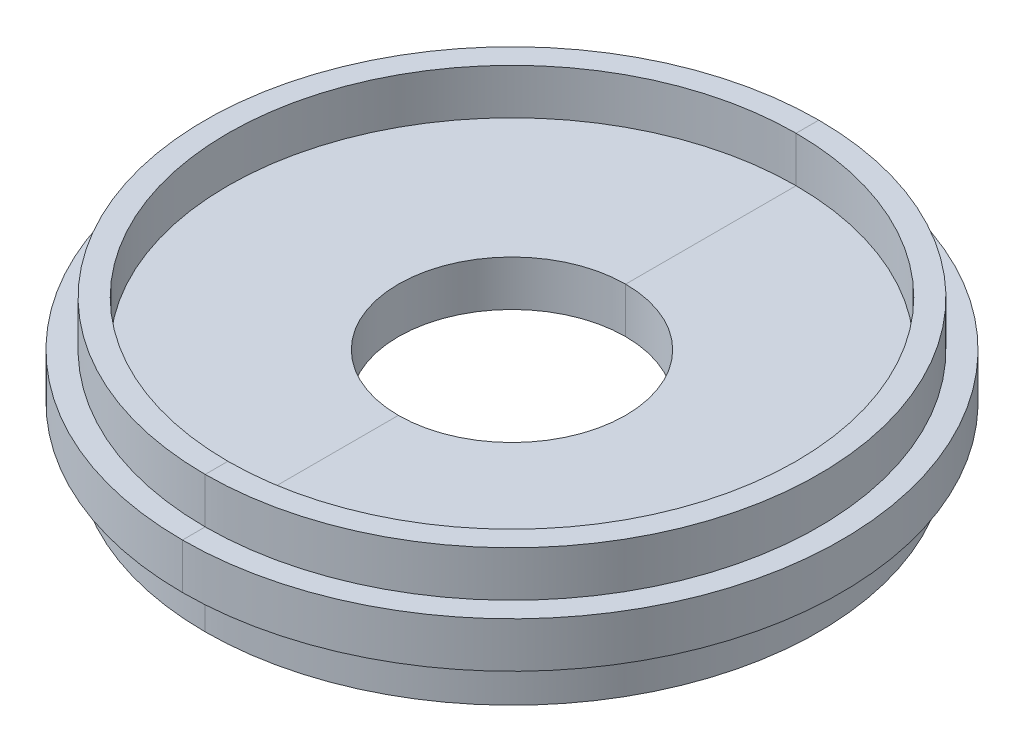
ISO-10303-21;
HEADER;
FILE_DESCRIPTION(('STEP AP214'),'2;1');
FILE_NAME('part.step','',(''),(''),'','','');
FILE_SCHEMA(('AUTOMOTIVE_DESIGN { 1 0 10303 214 1 1 1 1 }'));
ENDSEC;
DATA;
#1=APPLICATION_CONTEXT('core data for automotive mechanical design processes');
#2=APPLICATION_PROTOCOL_DEFINITION('international standard','automotive_design',2000,#1);
#3=PRODUCT_CONTEXT('',#1,'mechanical');
#4=PRODUCT('Part','Part','',(#3));
#5=PRODUCT_RELATED_PRODUCT_CATEGORY('part','',(#4));
#6=PRODUCT_DEFINITION_FORMATION('','',#4);
#7=PRODUCT_DEFINITION_CONTEXT('part definition',#1,'design');
#8=PRODUCT_DEFINITION('design','',#6,#7);
#9=PRODUCT_DEFINITION_SHAPE('','',#8);
#10=(LENGTH_UNIT() NAMED_UNIT(*) SI_UNIT(.MILLI.,.METRE.));
#11=(NAMED_UNIT(*) PLANE_ANGLE_UNIT() SI_UNIT($,.RADIAN.));
#12=(NAMED_UNIT(*) SI_UNIT($,.STERADIAN.) SOLID_ANGLE_UNIT());
#13=UNCERTAINTY_MEASURE_WITH_UNIT(LENGTH_MEASURE(1.E-05),#10,'distance_accuracy_value','');
#14=(GEOMETRIC_REPRESENTATION_CONTEXT(3) GLOBAL_UNCERTAINTY_ASSIGNED_CONTEXT((#13)) GLOBAL_UNIT_ASSIGNED_CONTEXT((#10,
#11,#12)) REPRESENTATION_CONTEXT('',''));
#15=CARTESIAN_POINT('',(0.,0.,0.));
#16=DIRECTION('',(0.,0.,1.));
#17=DIRECTION('',(1.,0.,0.));
#18=AXIS2_PLACEMENT_3D('',#15,#16,#17);
#19=CARTESIAN_POINT('',(0.,0.,0.));
#20=DIRECTION('',(1.,0.,0.));
#21=DIRECTION('',(0.,0.,-1.));
#22=AXIS2_PLACEMENT_3D('',#19,#20,#21);
#23=PLANE('',#22);
#24=DIRECTION('',(0.,0.,-1.));
#25=VECTOR('',#24,1.);
#26=CARTESIAN_POINT('',(0.,19.05,0.));
#27=LINE('',#26,#25);
#28=CARTESIAN_POINT('',(0.,19.05,-79.375));
#29=VERTEX_POINT('',#28);
#30=CARTESIAN_POINT('',(0.,19.05,-85.725));
#31=VERTEX_POINT('',#30);
#32=EDGE_CURVE('E217',#29,#31,#27,.T.);
#33=ORIENTED_EDGE('',*,*,#32,.F.);
#34=DIRECTION('',(0.,-1.,0.));
#35=VECTOR('',#34,1.);
#36=CARTESIAN_POINT('',(0.,19.05,-79.375));
#37=LINE('',#36,#35);
#38=CARTESIAN_POINT('',(0.,6.35,-79.375));
#39=VERTEX_POINT('',#38);
#40=EDGE_CURVE('E231',#39,#29,#37,.F.);
#41=ORIENTED_EDGE('',*,*,#40,.F.);
#42=DIRECTION('',(0.,0.,-1.));
#43=VECTOR('',#42,1.);
#44=CARTESIAN_POINT('',(0.,6.35,0.));
#45=LINE('',#44,#43);
#46=CARTESIAN_POINT('',(0.,6.35,-31.75));
#47=VERTEX_POINT('',#46);
#48=EDGE_CURVE('E240',#47,#39,#45,.T.);
#49=ORIENTED_EDGE('',*,*,#48,.F.);
#50=DIRECTION('',(0.,-1.,0.));
#51=VECTOR('',#50,1.);
#52=CARTESIAN_POINT('',(0.,6.35,-31.75));
#53=LINE('',#52,#51);
#54=CARTESIAN_POINT('',(0.,-6.35,-31.75));
#55=VERTEX_POINT('',#54);
#56=EDGE_CURVE('E233',#55,#47,#53,.F.);
#57=ORIENTED_EDGE('',*,*,#56,.F.);
#58=DIRECTION('',(0.,0.,-1.));
#59=VECTOR('',#58,1.);
#60=CARTESIAN_POINT('',(0.,-6.35,0.));
#61=LINE('',#60,#59);
#62=CARTESIAN_POINT('',(0.,-6.35,-79.375));
#63=VERTEX_POINT('',#62);
#64=EDGE_CURVE('E199',#55,#63,#61,.T.);
#65=ORIENTED_EDGE('',*,*,#64,.T.);
#66=DIRECTION('',(0.,1.,0.));
#67=VECTOR('',#66,1.);
#68=CARTESIAN_POINT('',(0.,-19.05,-79.375));
#69=LINE('',#68,#67);
#70=CARTESIAN_POINT('',(0.,-19.05,-79.375));
#71=VERTEX_POINT('',#70);
#72=EDGE_CURVE('E154',#63,#71,#69,.F.);
#73=ORIENTED_EDGE('',*,*,#72,.T.);
#74=DIRECTION('',(0.,0.,1.));
#75=VECTOR('',#74,1.);
#76=CARTESIAN_POINT('',(0.,-19.05,0.));
#77=LINE('',#76,#75);
#78=CARTESIAN_POINT('',(0.,-19.05,-85.725));
#79=VERTEX_POINT('',#78);
#80=EDGE_CURVE('E72',#79,#71,#77,.T.);
#81=ORIENTED_EDGE('',*,*,#80,.F.);
#82=DIRECTION('',(0.,1.,0.));
#83=VECTOR('',#82,1.);
#84=CARTESIAN_POINT('',(0.,-19.05,-85.725));
#85=LINE('',#84,#83);
#86=CARTESIAN_POINT('',(0.,-6.35,-85.725));
#87=VERTEX_POINT('',#86);
#88=EDGE_CURVE('E194',#87,#79,#85,.F.);
#89=ORIENTED_EDGE('',*,*,#88,.F.);
#90=DIRECTION('',(0.,0.,-1.));
#91=VECTOR('',#90,1.);
#92=CARTESIAN_POINT('',(0.,-6.35,0.));
#93=LINE('',#92,#91);
#94=CARTESIAN_POINT('',(0.,-6.35,-92.075));
#95=VERTEX_POINT('',#94);
#96=EDGE_CURVE('E191',#87,#95,#93,.T.);
#97=ORIENTED_EDGE('',*,*,#96,.T.);
#98=DIRECTION('',(0.,-1.,0.));
#99=VECTOR('',#98,1.);
#100=CARTESIAN_POINT('',(0.,6.35,-92.075));
#101=LINE('',#100,#99);
#102=CARTESIAN_POINT('',(0.,6.35,-92.075));
#103=VERTEX_POINT('',#102);
#104=EDGE_CURVE('E207',#95,#103,#101,.F.);
#105=ORIENTED_EDGE('',*,*,#104,.T.);
#106=DIRECTION('',(0.,0.,-1.));
#107=VECTOR('',#106,1.);
#108=CARTESIAN_POINT('',(0.,6.35,0.));
#109=LINE('',#108,#107);
#110=CARTESIAN_POINT('',(0.,6.35,-85.725));
#111=VERTEX_POINT('',#110);
#112=EDGE_CURVE('E220',#111,#103,#109,.T.);
#113=ORIENTED_EDGE('',*,*,#112,.F.);
#114=DIRECTION('',(0.,-1.,0.));
#115=VECTOR('',#114,1.);
#116=CARTESIAN_POINT('',(0.,19.05,-85.725));
#117=LINE('',#116,#115);
#118=EDGE_CURVE('E156',#111,#31,#117,.F.);
#119=ORIENTED_EDGE('',*,*,#118,.T.);
#120=EDGE_LOOP('',(#33,#41,#49,#57,#65,#73,#81,#89,#97,#105,#113,#119));
#121=FACE_BOUND('',#120,.T.);
#122=ADVANCED_FACE('F50',(#121),#23,.T.);
#123=CARTESIAN_POINT('',(0.,19.05,85.725));
#124=VERTEX_POINT('',#123);
#125=CARTESIAN_POINT('',(0.,19.05,79.375));
#126=VERTEX_POINT('',#125);
#127=EDGE_CURVE('E229',#124,#126,#27,.T.);
#128=ORIENTED_EDGE('',*,*,#127,.F.);
#129=DIRECTION('',(0.,-1.,0.));
#130=VECTOR('',#129,1.);
#131=CARTESIAN_POINT('',(0.,19.05,85.725));
#132=LINE('',#131,#130);
#133=CARTESIAN_POINT('',(0.,6.35,85.725));
#134=VERTEX_POINT('',#133);
#135=EDGE_CURVE('E210',#124,#134,#132,.T.);
#136=ORIENTED_EDGE('',*,*,#135,.T.);
#137=CARTESIAN_POINT('',(0.,6.35,92.075));
#138=VERTEX_POINT('',#137);
#139=EDGE_CURVE('E239',#138,#134,#109,.T.);
#140=ORIENTED_EDGE('',*,*,#139,.F.);
#141=DIRECTION('',(0.,-1.,0.));
#142=VECTOR('',#141,1.);
#143=CARTESIAN_POINT('',(0.,6.35,92.075));
#144=LINE('',#143,#142);
#145=CARTESIAN_POINT('',(0.,-6.35,92.075));
#146=VERTEX_POINT('',#145);
#147=EDGE_CURVE('E198',#138,#146,#144,.T.);
#148=ORIENTED_EDGE('',*,*,#147,.T.);
#149=CARTESIAN_POINT('',(0.,-6.35,85.725));
#150=VERTEX_POINT('',#149);
#151=EDGE_CURVE('E188',#146,#150,#93,.T.);
#152=ORIENTED_EDGE('',*,*,#151,.T.);
#153=DIRECTION('',(0.,1.,0.));
#154=VECTOR('',#153,1.);
#155=CARTESIAN_POINT('',(0.,-19.05,85.725));
#156=LINE('',#155,#154);
#157=CARTESIAN_POINT('',(0.,-19.05,85.725));
#158=VERTEX_POINT('',#157);
#159=EDGE_CURVE('E148',#158,#150,#156,.T.);
#160=ORIENTED_EDGE('',*,*,#159,.F.);
#161=CARTESIAN_POINT('',(0.,-19.05,79.375));
#162=VERTEX_POINT('',#161);
#163=EDGE_CURVE('E64',#162,#158,#77,.T.);
#164=ORIENTED_EDGE('',*,*,#163,.F.);
#165=DIRECTION('',(0.,1.,0.));
#166=VECTOR('',#165,1.);
#167=CARTESIAN_POINT('',(0.,-19.05,79.375));
#168=LINE('',#167,#166);
#169=CARTESIAN_POINT('',(0.,-6.35,79.375));
#170=VERTEX_POINT('',#169);
#171=EDGE_CURVE('E146',#162,#170,#168,.T.);
#172=ORIENTED_EDGE('',*,*,#171,.T.);
#173=CARTESIAN_POINT('',(0.,-6.35,31.75));
#174=VERTEX_POINT('',#173);
#175=EDGE_CURVE('E202',#170,#174,#61,.T.);
#176=ORIENTED_EDGE('',*,*,#175,.T.);
#177=DIRECTION('',(0.,-1.,0.));
#178=VECTOR('',#177,1.);
#179=CARTESIAN_POINT('',(0.,6.35,31.75));
#180=LINE('',#179,#178);
#181=CARTESIAN_POINT('',(0.,6.35,31.75));
#182=VERTEX_POINT('',#181);
#183=EDGE_CURVE('E237',#182,#174,#180,.T.);
#184=ORIENTED_EDGE('',*,*,#183,.F.);
#185=CARTESIAN_POINT('',(0.,6.35,79.375));
#186=VERTEX_POINT('',#185);
#187=EDGE_CURVE('E241',#186,#182,#45,.T.);
#188=ORIENTED_EDGE('',*,*,#187,.F.);
#189=DIRECTION('',(0.,-1.,0.));
#190=VECTOR('',#189,1.);
#191=CARTESIAN_POINT('',(0.,19.05,79.375));
#192=LINE('',#191,#190);
#193=EDGE_CURVE('E228',#126,#186,#192,.T.);
#194=ORIENTED_EDGE('',*,*,#193,.F.);
#195=EDGE_LOOP('',(#128,#136,#140,#148,#152,#160,#164,#172,#176,#184,#188,#194));
#196=FACE_BOUND('',#195,.T.);
#197=ADVANCED_FACE('F144',(#196),#23,.T.);
#198=CARTESIAN_POINT('',(0.,-6.35,0.));
#199=DIRECTION('',(0.,1.,0.));
#200=DIRECTION('',(0.,0.,1.));
#201=AXIS2_PLACEMENT_3D('',#198,#199,#200);
#202=PLANE('',#201);
#203=ORIENTED_EDGE('',*,*,#175,.F.);
#204=CARTESIAN_POINT('',(0.,-6.35,0.));
#205=DIRECTION('',(0.,1.,0.));
#206=DIRECTION('',(0.,0.,1.));
#207=AXIS2_PLACEMENT_3D('',#204,#205,#206);
#208=CIRCLE('',#207,79.375);
#209=EDGE_CURVE('E150',#63,#170,#208,.T.);
#210=ORIENTED_EDGE('',*,*,#209,.F.);
#211=ORIENTED_EDGE('',*,*,#64,.F.);
#212=CARTESIAN_POINT('',(0.,-6.35,0.));
#213=DIRECTION('',(0.,1.,0.));
#214=DIRECTION('',(0.,0.,1.));
#215=AXIS2_PLACEMENT_3D('',#212,#213,#214);
#216=CIRCLE('',#215,31.75);
#217=EDGE_CURVE('E171',#55,#174,#216,.T.);
#218=ORIENTED_EDGE('',*,*,#217,.T.);
#219=EDGE_LOOP('',(#203,#210,#211,#218));
#220=FACE_BOUND('',#219,.T.);
#221=ADVANCED_FACE('F251',(#220),#202,.F.);
#222=CARTESIAN_POINT('',(0.,6.35,0.));
#223=DIRECTION('',(0.,1.,0.));
#224=DIRECTION('',(0.,0.,1.));
#225=AXIS2_PLACEMENT_3D('',#222,#223,#224);
#226=PLANE('',#225);
#227=CARTESIAN_POINT('',(0.,6.35,0.));
#228=DIRECTION('',(0.,1.,0.));
#229=DIRECTION('',(0.,0.,1.));
#230=AXIS2_PLACEMENT_3D('',#227,#228,#229);
#231=CIRCLE('',#230,79.375);
#232=EDGE_CURVE('E161',#186,#39,#231,.F.);
#233=ORIENTED_EDGE('',*,*,#232,.F.);
#234=ORIENTED_EDGE('',*,*,#187,.T.);
#235=CARTESIAN_POINT('',(0.,6.35,0.));
#236=DIRECTION('',(0.,1.,0.));
#237=DIRECTION('',(0.,0.,1.));
#238=AXIS2_PLACEMENT_3D('',#235,#236,#237);
#239=CIRCLE('',#238,31.75);
#240=EDGE_CURVE('E168',#47,#182,#239,.T.);
#241=ORIENTED_EDGE('',*,*,#240,.F.);
#242=ORIENTED_EDGE('',*,*,#48,.T.);
#243=EDGE_LOOP('',(#233,#234,#241,#242));
#244=FACE_BOUND('',#243,.T.);
#245=ADVANCED_FACE('F255',(#244),#226,.T.);
#246=CARTESIAN_POINT('',(0.,6.35,0.));
#247=DIRECTION('',(0.,1.,0.));
#248=DIRECTION('',(0.,0.,1.));
#249=AXIS2_PLACEMENT_3D('',#246,#247,#248);
#250=CIRCLE('',#249,92.075);
#251=EDGE_CURVE('E164',#103,#138,#250,.T.);
#252=ORIENTED_EDGE('',*,*,#251,.T.);
#253=ORIENTED_EDGE('',*,*,#139,.T.);
#254=CARTESIAN_POINT('',(0.,6.35,0.));
#255=DIRECTION('',(0.,1.,0.));
#256=DIRECTION('',(0.,0.,1.));
#257=AXIS2_PLACEMENT_3D('',#254,#255,#256);
#258=CIRCLE('',#257,85.725);
#259=EDGE_CURVE('E176',#111,#134,#258,.T.);
#260=ORIENTED_EDGE('',*,*,#259,.F.);
#261=ORIENTED_EDGE('',*,*,#112,.T.);
#262=EDGE_LOOP('',(#252,#253,#260,#261));
#263=FACE_BOUND('',#262,.T.);
#264=ADVANCED_FACE('F262',(#263),#226,.T.);
#265=ORIENTED_EDGE('',*,*,#151,.F.);
#266=CARTESIAN_POINT('',(0.,-6.35,0.));
#267=DIRECTION('',(0.,1.,0.));
#268=DIRECTION('',(0.,0.,1.));
#269=AXIS2_PLACEMENT_3D('',#266,#267,#268);
#270=CIRCLE('',#269,92.075);
#271=EDGE_CURVE('E166',#95,#146,#270,.T.);
#272=ORIENTED_EDGE('',*,*,#271,.F.);
#273=ORIENTED_EDGE('',*,*,#96,.F.);
#274=CARTESIAN_POINT('',(0.,-6.35,0.));
#275=DIRECTION('',(0.,1.,0.));
#276=DIRECTION('',(0.,0.,1.));
#277=AXIS2_PLACEMENT_3D('',#274,#275,#276);
#278=CIRCLE('',#277,85.725);
#279=EDGE_CURVE('E58',#87,#150,#278,.T.);
#280=ORIENTED_EDGE('',*,*,#279,.T.);
#281=EDGE_LOOP('',(#265,#272,#273,#280));
#282=FACE_BOUND('',#281,.T.);
#283=ADVANCED_FACE('F187',(#282),#202,.F.);
#284=CARTESIAN_POINT('',(0.,6.35,0.));
#285=DIRECTION('',(0.,-1.,0.));
#286=DIRECTION('',(0.,0.,-1.));
#287=AXIS2_PLACEMENT_3D('',#284,#285,#286);
#288=CYLINDRICAL_SURFACE('',#287,92.075);
#289=ORIENTED_EDGE('',*,*,#147,.F.);
#290=ORIENTED_EDGE('',*,*,#251,.F.);
#291=ORIENTED_EDGE('',*,*,#104,.F.);
#292=ORIENTED_EDGE('',*,*,#271,.T.);
#293=EDGE_LOOP('',(#289,#290,#291,#292));
#294=FACE_BOUND('',#293,.T.);
#295=ADVANCED_FACE('F52',(#294),#288,.T.);
#296=CARTESIAN_POINT('',(0.,6.35,0.));
#297=DIRECTION('',(0.,-1.,0.));
#298=DIRECTION('',(0.,0.,-1.));
#299=AXIS2_PLACEMENT_3D('',#296,#297,#298);
#300=CYLINDRICAL_SURFACE('',#299,31.75);
#301=ORIENTED_EDGE('',*,*,#240,.T.);
#302=ORIENTED_EDGE('',*,*,#183,.T.);
#303=ORIENTED_EDGE('',*,*,#217,.F.);
#304=ORIENTED_EDGE('',*,*,#56,.T.);
#305=EDGE_LOOP('',(#301,#302,#303,#304));
#306=FACE_BOUND('',#305,.T.);
#307=ADVANCED_FACE('F253',(#306),#300,.F.);
#308=CARTESIAN_POINT('',(0.,19.05,0.));
#309=DIRECTION('',(0.,1.,0.));
#310=DIRECTION('',(0.,0.,1.));
#311=AXIS2_PLACEMENT_3D('',#308,#309,#310);
#312=PLANE('',#311);
#313=CARTESIAN_POINT('',(0.,19.05,0.));
#314=DIRECTION('',(0.,1.,0.));
#315=DIRECTION('',(0.,0.,1.));
#316=AXIS2_PLACEMENT_3D('',#313,#314,#315);
#317=CIRCLE('',#316,85.725);
#318=EDGE_CURVE('E174',#31,#124,#317,.T.);
#319=ORIENTED_EDGE('',*,*,#318,.T.);
#320=ORIENTED_EDGE('',*,*,#127,.T.);
#321=CARTESIAN_POINT('',(0.,19.05,0.));
#322=DIRECTION('',(0.,1.,0.));
#323=DIRECTION('',(0.,0.,1.));
#324=AXIS2_PLACEMENT_3D('',#321,#322,#323);
#325=CIRCLE('',#324,79.375);
#326=EDGE_CURVE('E178',#29,#126,#325,.T.);
#327=ORIENTED_EDGE('',*,*,#326,.F.);
#328=ORIENTED_EDGE('',*,*,#32,.T.);
#329=EDGE_LOOP('',(#319,#320,#327,#328));
#330=FACE_BOUND('',#329,.T.);
#331=ADVANCED_FACE('F227',(#330),#312,.T.);
#332=CARTESIAN_POINT('',(0.,19.05,0.));
#333=DIRECTION('',(0.,-1.,0.));
#334=DIRECTION('',(0.,0.,-1.));
#335=AXIS2_PLACEMENT_3D('',#332,#333,#334);
#336=CYLINDRICAL_SURFACE('',#335,85.725);
#337=ORIENTED_EDGE('',*,*,#135,.F.);
#338=ORIENTED_EDGE('',*,*,#318,.F.);
#339=ORIENTED_EDGE('',*,*,#118,.F.);
#340=ORIENTED_EDGE('',*,*,#259,.T.);
#341=EDGE_LOOP('',(#337,#338,#339,#340));
#342=FACE_BOUND('',#341,.T.);
#343=ADVANCED_FACE('F223',(#342),#336,.T.);
#344=CARTESIAN_POINT('',(0.,19.05,0.));
#345=DIRECTION('',(0.,-1.,0.));
#346=DIRECTION('',(0.,0.,-1.));
#347=AXIS2_PLACEMENT_3D('',#344,#345,#346);
#348=CYLINDRICAL_SURFACE('',#347,79.375);
#349=ORIENTED_EDGE('',*,*,#326,.T.);
#350=ORIENTED_EDGE('',*,*,#193,.T.);
#351=ORIENTED_EDGE('',*,*,#232,.T.);
#352=ORIENTED_EDGE('',*,*,#40,.T.);
#353=EDGE_LOOP('',(#349,#350,#351,#352));
#354=FACE_BOUND('',#353,.T.);
#355=ADVANCED_FACE('F257',(#354),#348,.F.);
#356=CARTESIAN_POINT('',(0.,-19.05,0.));
#357=DIRECTION('',(0.,1.,0.));
#358=DIRECTION('',(0.,0.,1.));
#359=AXIS2_PLACEMENT_3D('',#356,#357,#358);
#360=CYLINDRICAL_SURFACE('',#359,85.725);
#361=ORIENTED_EDGE('',*,*,#279,.F.);
#362=ORIENTED_EDGE('',*,*,#88,.T.);
#363=CARTESIAN_POINT('',(0.,-19.05,0.));
#364=DIRECTION('',(0.,1.,0.));
#365=DIRECTION('',(0.,0.,1.));
#366=AXIS2_PLACEMENT_3D('',#363,#364,#365);
#367=CIRCLE('',#366,85.725);
#368=EDGE_CURVE('E181',#79,#158,#367,.T.);
#369=ORIENTED_EDGE('',*,*,#368,.T.);
#370=ORIENTED_EDGE('',*,*,#159,.T.);
#371=EDGE_LOOP('',(#361,#362,#369,#370));
#372=FACE_BOUND('',#371,.T.);
#373=ADVANCED_FACE('F193',(#372),#360,.T.);
#374=CARTESIAN_POINT('',(0.,-19.05,0.));
#375=DIRECTION('',(0.,-1.,0.));
#376=DIRECTION('',(0.,0.,1.));
#377=AXIS2_PLACEMENT_3D('',#374,#375,#376);
#378=PLANE('',#377);
#379=ORIENTED_EDGE('',*,*,#368,.F.);
#380=ORIENTED_EDGE('',*,*,#80,.T.);
#381=CARTESIAN_POINT('',(0.,-19.05,0.));
#382=DIRECTION('',(0.,1.,0.));
#383=DIRECTION('',(0.,0.,1.));
#384=AXIS2_PLACEMENT_3D('',#381,#382,#383);
#385=CIRCLE('',#384,79.375);
#386=EDGE_CURVE('E13',#71,#162,#385,.T.);
#387=ORIENTED_EDGE('',*,*,#386,.T.);
#388=ORIENTED_EDGE('',*,*,#163,.T.);
#389=EDGE_LOOP('',(#379,#380,#387,#388));
#390=FACE_BOUND('',#389,.T.);
#391=ADVANCED_FACE('F137',(#390),#378,.T.);
#392=CARTESIAN_POINT('',(0.,-19.05,0.));
#393=DIRECTION('',(0.,1.,0.));
#394=DIRECTION('',(0.,0.,1.));
#395=AXIS2_PLACEMENT_3D('',#392,#393,#394);
#396=CYLINDRICAL_SURFACE('',#395,79.375);
#397=ORIENTED_EDGE('',*,*,#72,.F.);
#398=ORIENTED_EDGE('',*,*,#209,.T.);
#399=ORIENTED_EDGE('',*,*,#171,.F.);
#400=ORIENTED_EDGE('',*,*,#386,.F.);
#401=EDGE_LOOP('',(#397,#398,#399,#400));
#402=FACE_BOUND('',#401,.T.);
#403=ADVANCED_FACE('F152',(#402),#396,.F.);
#404=CLOSED_SHELL('',(#122,#197,#221,#245,#264,#283,#295,#307,#331,#343,#355,#373,#391,#403));
#405=MANIFOLD_SOLID_BREP('B2',#404);
#406=CARTESIAN_POINT('',(0.,0.,0.));
#407=DIRECTION('',(1.,0.,0.));
#408=DIRECTION('',(0.,0.,-1.));
#409=AXIS2_PLACEMENT_3D('',#406,#407,#408);
#410=PLANE('',#409);
#411=DIRECTION('',(0.,0.,-1.));
#412=VECTOR('',#411,1.);
#413=CARTESIAN_POINT('',(0.,19.05,0.));
#414=LINE('',#413,#412);
#415=CARTESIAN_POINT('',(0.,19.05,-79.375));
#416=VERTEX_POINT('',#415);
#417=CARTESIAN_POINT('',(0.,19.05,-85.725));
#418=VERTEX_POINT('',#417);
#419=EDGE_CURVE('E562',#416,#418,#414,.T.);
#420=ORIENTED_EDGE('',*,*,#419,.T.);
#421=DIRECTION('',(0.,-1.,0.));
#422=VECTOR('',#421,1.);
#423=CARTESIAN_POINT('',(0.,19.05,-85.725));
#424=LINE('',#423,#422);
#425=CARTESIAN_POINT('',(0.,6.35,-85.725));
#426=VERTEX_POINT('',#425);
#427=EDGE_CURVE('E377',#426,#418,#424,.F.);
#428=ORIENTED_EDGE('',*,*,#427,.F.);
#429=DIRECTION('',(0.,0.,-1.));
#430=VECTOR('',#429,1.);
#431=CARTESIAN_POINT('',(0.,6.35,0.));
#432=LINE('',#431,#430);
#433=CARTESIAN_POINT('',(0.,6.35,-92.075));
#434=VERTEX_POINT('',#433);
#435=EDGE_CURVE('E544',#426,#434,#432,.T.);
#436=ORIENTED_EDGE('',*,*,#435,.T.);
#437=DIRECTION('',(0.,-1.,0.));
#438=VECTOR('',#437,1.);
#439=CARTESIAN_POINT('',(0.,6.35,-92.075));
#440=LINE('',#439,#438);
#441=CARTESIAN_POINT('',(0.,-6.35,-92.075));
#442=VERTEX_POINT('',#441);
#443=EDGE_CURVE('E548',#442,#434,#440,.F.);
#444=ORIENTED_EDGE('',*,*,#443,.F.);
#445=DIRECTION('',(0.,0.,-1.));
#446=VECTOR('',#445,1.);
#447=CARTESIAN_POINT('',(0.,-6.35,0.));
#448=LINE('',#447,#446);
#449=CARTESIAN_POINT('',(0.,-6.35,-85.725));
#450=VERTEX_POINT('',#449);
#451=EDGE_CURVE('E536',#450,#442,#448,.T.);
#452=ORIENTED_EDGE('',*,*,#451,.F.);
#453=DIRECTION('',(0.,1.,0.));
#454=VECTOR('',#453,1.);
#455=CARTESIAN_POINT('',(0.,-19.05,-85.725));
#456=LINE('',#455,#454);
#457=CARTESIAN_POINT('',(0.,-19.05,-85.725));
#458=VERTEX_POINT('',#457);
#459=EDGE_CURVE('E531',#450,#458,#456,.F.);
#460=ORIENTED_EDGE('',*,*,#459,.T.);
#461=DIRECTION('',(0.,0.,1.));
#462=VECTOR('',#461,1.);
#463=CARTESIAN_POINT('',(0.,-19.05,0.));
#464=LINE('',#463,#462);
#465=CARTESIAN_POINT('',(0.,-19.05,-79.375));
#466=VERTEX_POINT('',#465);
#467=EDGE_CURVE('E383',#458,#466,#464,.T.);
#468=ORIENTED_EDGE('',*,*,#467,.T.);
#469=DIRECTION('',(0.,1.,0.));
#470=VECTOR('',#469,1.);
#471=CARTESIAN_POINT('',(0.,-19.05,-79.375));
#472=LINE('',#471,#470);
#473=CARTESIAN_POINT('',(0.,-6.35,-79.375));
#474=VERTEX_POINT('',#473);
#475=EDGE_CURVE('E479',#474,#466,#472,.F.);
#476=ORIENTED_EDGE('',*,*,#475,.F.);
#477=DIRECTION('',(0.,0.,-1.));
#478=VECTOR('',#477,1.);
#479=CARTESIAN_POINT('',(0.,-6.35,0.));
#480=LINE('',#479,#478);
#481=CARTESIAN_POINT('',(0.,-6.35,-31.75));
#482=VERTEX_POINT('',#481);
#483=EDGE_CURVE('E535',#482,#474,#480,.T.);
#484=ORIENTED_EDGE('',*,*,#483,.F.);
#485=DIRECTION('',(0.,-1.,0.));
#486=VECTOR('',#485,1.);
#487=CARTESIAN_POINT('',(0.,6.35,-31.75));
#488=LINE('',#487,#486);
#489=CARTESIAN_POINT('',(0.,6.35,-31.75));
#490=VERTEX_POINT('',#489);
#491=EDGE_CURVE('E543',#482,#490,#488,.F.);
#492=ORIENTED_EDGE('',*,*,#491,.T.);
#493=DIRECTION('',(0.,0.,-1.));
#494=VECTOR('',#493,1.);
#495=CARTESIAN_POINT('',(0.,6.35,0.));
#496=LINE('',#495,#494);
#497=CARTESIAN_POINT('',(0.,6.35,-79.375));
#498=VERTEX_POINT('',#497);
#499=EDGE_CURVE('E553',#490,#498,#496,.T.);
#500=ORIENTED_EDGE('',*,*,#499,.T.);
#501=DIRECTION('',(0.,-1.,0.));
#502=VECTOR('',#501,1.);
#503=CARTESIAN_POINT('',(0.,19.05,-79.375));
#504=LINE('',#503,#502);
#505=EDGE_CURVE('E561',#498,#416,#504,.F.);
#506=ORIENTED_EDGE('',*,*,#505,.T.);
#507=EDGE_LOOP('',(#420,#428,#436,#444,#452,#460,#468,#476,#484,#492,#500,#506));
#508=FACE_BOUND('',#507,.T.);
#509=ADVANCED_FACE('F373',(#508),#410,.F.);
#510=CARTESIAN_POINT('',(0.,19.05,85.725));
#511=VERTEX_POINT('',#510);
#512=CARTESIAN_POINT('',(0.,19.05,79.375));
#513=VERTEX_POINT('',#512);
#514=EDGE_CURVE('E569',#511,#513,#414,.T.);
#515=ORIENTED_EDGE('',*,*,#514,.T.);
#516=DIRECTION('',(0.,-1.,0.));
#517=VECTOR('',#516,1.);
#518=CARTESIAN_POINT('',(0.,19.05,79.375));
#519=LINE('',#518,#517);
#520=CARTESIAN_POINT('',(0.,6.35,79.375));
#521=VERTEX_POINT('',#520);
#522=EDGE_CURVE('E557',#513,#521,#519,.T.);
#523=ORIENTED_EDGE('',*,*,#522,.T.);
#524=CARTESIAN_POINT('',(0.,6.35,31.75));
#525=VERTEX_POINT('',#524);
#526=EDGE_CURVE('E539',#521,#525,#496,.T.);
#527=ORIENTED_EDGE('',*,*,#526,.T.);
#528=DIRECTION('',(0.,-1.,0.));
#529=VECTOR('',#528,1.);
#530=CARTESIAN_POINT('',(0.,6.35,31.75));
#531=LINE('',#530,#529);
#532=CARTESIAN_POINT('',(0.,-6.35,31.75));
#533=VERTEX_POINT('',#532);
#534=EDGE_CURVE('E540',#525,#533,#531,.T.);
#535=ORIENTED_EDGE('',*,*,#534,.T.);
#536=CARTESIAN_POINT('',(0.,-6.35,79.375));
#537=VERTEX_POINT('',#536);
#538=EDGE_CURVE('E474',#537,#533,#480,.T.);
#539=ORIENTED_EDGE('',*,*,#538,.F.);
#540=DIRECTION('',(0.,1.,0.));
#541=VECTOR('',#540,1.);
#542=CARTESIAN_POINT('',(0.,-19.05,79.375));
#543=LINE('',#542,#541);
#544=CARTESIAN_POINT('',(0.,-19.05,79.375));
#545=VERTEX_POINT('',#544);
#546=EDGE_CURVE('E471',#545,#537,#543,.T.);
#547=ORIENTED_EDGE('',*,*,#546,.F.);
#548=CARTESIAN_POINT('',(0.,-19.05,85.725));
#549=VERTEX_POINT('',#548);
#550=EDGE_CURVE('E48',#545,#549,#464,.T.);
#551=ORIENTED_EDGE('',*,*,#550,.T.);
#552=DIRECTION('',(0.,1.,0.));
#553=VECTOR('',#552,1.);
#554=CARTESIAN_POINT('',(0.,-19.05,85.725));
#555=LINE('',#554,#553);
#556=CARTESIAN_POINT('',(0.,-6.35,85.725));
#557=VERTEX_POINT('',#556);
#558=EDGE_CURVE('E391',#549,#557,#555,.T.);
#559=ORIENTED_EDGE('',*,*,#558,.T.);
#560=CARTESIAN_POINT('',(0.,-6.35,92.075));
#561=VERTEX_POINT('',#560);
#562=EDGE_CURVE('E532',#561,#557,#448,.T.);
#563=ORIENTED_EDGE('',*,*,#562,.F.);
#564=DIRECTION('',(0.,-1.,0.));
#565=VECTOR('',#564,1.);
#566=CARTESIAN_POINT('',(0.,6.35,92.075));
#567=LINE('',#566,#565);
#568=CARTESIAN_POINT('',(0.,6.35,92.075));
#569=VERTEX_POINT('',#568);
#570=EDGE_CURVE('E545',#569,#561,#567,.T.);
#571=ORIENTED_EDGE('',*,*,#570,.F.);
#572=CARTESIAN_POINT('',(0.,6.35,85.725));
#573=VERTEX_POINT('',#572);
#574=EDGE_CURVE('E552',#569,#573,#432,.T.);
#575=ORIENTED_EDGE('',*,*,#574,.T.);
#576=DIRECTION('',(0.,-1.,0.));
#577=VECTOR('',#576,1.);
#578=CARTESIAN_POINT('',(0.,19.05,85.725));
#579=LINE('',#578,#577);
#580=EDGE_CURVE('E563',#511,#573,#579,.T.);
#581=ORIENTED_EDGE('',*,*,#580,.F.);
#582=EDGE_LOOP('',(#515,#523,#527,#535,#539,#547,#551,#559,#563,#571,#575,#581));
#583=FACE_BOUND('',#582,.T.);
#584=ADVANCED_FACE('F375',(#583),#410,.F.);
#585=CARTESIAN_POINT('',(0.,-6.35,0.));
#586=DIRECTION('',(0.,1.,0.));
#587=DIRECTION('',(0.,0.,1.));
#588=AXIS2_PLACEMENT_3D('',#585,#586,#587);
#589=PLANE('',#588);
#590=CARTESIAN_POINT('',(0.,-6.35,0.));
#591=DIRECTION('',(0.,1.,0.));
#592=DIRECTION('',(0.,0.,1.));
#593=AXIS2_PLACEMENT_3D('',#590,#591,#592);
#594=CIRCLE('',#593,92.075);
#595=EDGE_CURVE('E510',#561,#442,#594,.T.);
#596=ORIENTED_EDGE('',*,*,#595,.F.);
#597=ORIENTED_EDGE('',*,*,#562,.T.);
#598=CARTESIAN_POINT('',(0.,-6.35,0.));
#599=DIRECTION('',(0.,1.,0.));
#600=DIRECTION('',(0.,0.,1.));
#601=AXIS2_PLACEMENT_3D('',#598,#599,#600);
#602=CIRCLE('',#601,85.725);
#603=EDGE_CURVE('E485',#557,#450,#602,.T.);
#604=ORIENTED_EDGE('',*,*,#603,.T.);
#605=ORIENTED_EDGE('',*,*,#451,.T.);
#606=EDGE_LOOP('',(#596,#597,#604,#605));
#607=FACE_BOUND('',#606,.T.);
#608=ADVANCED_FACE('F610',(#607),#589,.F.);
#609=CARTESIAN_POINT('',(0.,-19.05,0.));
#610=DIRECTION('',(0.,1.,0.));
#611=DIRECTION('',(0.,0.,1.));
#612=AXIS2_PLACEMENT_3D('',#609,#610,#611);
#613=CYLINDRICAL_SURFACE('',#612,85.725);
#614=ORIENTED_EDGE('',*,*,#459,.F.);
#615=ORIENTED_EDGE('',*,*,#603,.F.);
#616=ORIENTED_EDGE('',*,*,#558,.F.);
#617=CARTESIAN_POINT('',(0.,-19.05,0.));
#618=DIRECTION('',(0.,1.,0.));
#619=DIRECTION('',(0.,0.,1.));
#620=AXIS2_PLACEMENT_3D('',#617,#618,#619);
#621=CIRCLE('',#620,85.725);
#622=EDGE_CURVE('E468',#549,#458,#621,.T.);
#623=ORIENTED_EDGE('',*,*,#622,.T.);
#624=EDGE_LOOP('',(#614,#615,#616,#623));
#625=FACE_BOUND('',#624,.T.);
#626=ADVANCED_FACE('F611',(#625),#613,.T.);
#627=CARTESIAN_POINT('',(0.,-19.05,0.));
#628=DIRECTION('',(0.,-1.,0.));
#629=DIRECTION('',(0.,0.,1.));
#630=AXIS2_PLACEMENT_3D('',#627,#628,#629);
#631=PLANE('',#630);
#632=ORIENTED_EDGE('',*,*,#467,.F.);
#633=ORIENTED_EDGE('',*,*,#622,.F.);
#634=ORIENTED_EDGE('',*,*,#550,.F.);
#635=CARTESIAN_POINT('',(0.,-19.05,0.));
#636=DIRECTION('',(0.,1.,0.));
#637=DIRECTION('',(0.,0.,1.));
#638=AXIS2_PLACEMENT_3D('',#635,#636,#637);
#639=CIRCLE('',#638,79.375);
#640=EDGE_CURVE('E467',#545,#466,#639,.T.);
#641=ORIENTED_EDGE('',*,*,#640,.T.);
#642=EDGE_LOOP('',(#632,#633,#634,#641));
#643=FACE_BOUND('',#642,.T.);
#644=ADVANCED_FACE('F465',(#643),#631,.T.);
#645=CARTESIAN_POINT('',(0.,-6.35,0.));
#646=DIRECTION('',(0.,1.,0.));
#647=DIRECTION('',(0.,0.,1.));
#648=AXIS2_PLACEMENT_3D('',#645,#646,#647);
#649=CIRCLE('',#648,79.375);
#650=EDGE_CURVE('E480',#537,#474,#649,.T.);
#651=ORIENTED_EDGE('',*,*,#650,.F.);
#652=ORIENTED_EDGE('',*,*,#538,.T.);
#653=CARTESIAN_POINT('',(0.,-6.35,0.));
#654=DIRECTION('',(0.,1.,0.));
#655=DIRECTION('',(0.,0.,1.));
#656=AXIS2_PLACEMENT_3D('',#653,#654,#655);
#657=CIRCLE('',#656,31.75);
#658=EDGE_CURVE('E502',#533,#482,#657,.T.);
#659=ORIENTED_EDGE('',*,*,#658,.T.);
#660=ORIENTED_EDGE('',*,*,#483,.T.);
#661=EDGE_LOOP('',(#651,#652,#659,#660));
#662=FACE_BOUND('',#661,.T.);
#663=ADVANCED_FACE('F618',(#662),#589,.F.);
#664=CARTESIAN_POINT('',(0.,-19.05,0.));
#665=DIRECTION('',(0.,1.,0.));
#666=DIRECTION('',(0.,0.,1.));
#667=AXIS2_PLACEMENT_3D('',#664,#665,#666);
#668=CYLINDRICAL_SURFACE('',#667,79.375);
#669=ORIENTED_EDGE('',*,*,#650,.T.);
#670=ORIENTED_EDGE('',*,*,#475,.T.);
#671=ORIENTED_EDGE('',*,*,#640,.F.);
#672=ORIENTED_EDGE('',*,*,#546,.T.);
#673=EDGE_LOOP('',(#669,#670,#671,#672));
#674=FACE_BOUND('',#673,.T.);
#675=ADVANCED_FACE('F482',(#674),#668,.F.);
#676=CARTESIAN_POINT('',(0.,6.35,0.));
#677=DIRECTION('',(0.,1.,0.));
#678=DIRECTION('',(0.,0.,1.));
#679=AXIS2_PLACEMENT_3D('',#676,#677,#678);
#680=PLANE('',#679);
#681=ORIENTED_EDGE('',*,*,#574,.F.);
#682=CARTESIAN_POINT('',(0.,6.35,0.));
#683=DIRECTION('',(0.,1.,0.));
#684=DIRECTION('',(0.,0.,1.));
#685=AXIS2_PLACEMENT_3D('',#682,#683,#684);
#686=CIRCLE('',#685,92.075);
#687=EDGE_CURVE('E514',#569,#434,#686,.T.);
#688=ORIENTED_EDGE('',*,*,#687,.T.);
#689=ORIENTED_EDGE('',*,*,#435,.F.);
#690=CARTESIAN_POINT('',(0.,6.35,0.));
#691=DIRECTION('',(0.,1.,0.));
#692=DIRECTION('',(0.,0.,1.));
#693=AXIS2_PLACEMENT_3D('',#690,#691,#692);
#694=CIRCLE('',#693,85.725);
#695=EDGE_CURVE('E497',#573,#426,#694,.T.);
#696=ORIENTED_EDGE('',*,*,#695,.F.);
#697=EDGE_LOOP('',(#681,#688,#689,#696));
#698=FACE_BOUND('',#697,.T.);
#699=ADVANCED_FACE('F603',(#698),#680,.T.);
#700=ORIENTED_EDGE('',*,*,#526,.F.);
#701=CARTESIAN_POINT('',(0.,6.35,0.));
#702=DIRECTION('',(0.,1.,0.));
#703=DIRECTION('',(0.,0.,1.));
#704=AXIS2_PLACEMENT_3D('',#701,#702,#703);
#705=CIRCLE('',#704,79.375);
#706=EDGE_CURVE('E518',#498,#521,#705,.F.);
#707=ORIENTED_EDGE('',*,*,#706,.F.);
#708=ORIENTED_EDGE('',*,*,#499,.F.);
#709=CARTESIAN_POINT('',(0.,6.35,0.));
#710=DIRECTION('',(0.,1.,0.));
#711=DIRECTION('',(0.,0.,1.));
#712=AXIS2_PLACEMENT_3D('',#709,#710,#711);
#713=CIRCLE('',#712,31.75);
#714=EDGE_CURVE('E506',#525,#490,#713,.T.);
#715=ORIENTED_EDGE('',*,*,#714,.F.);
#716=EDGE_LOOP('',(#700,#707,#708,#715));
#717=FACE_BOUND('',#716,.T.);
#718=ADVANCED_FACE('F637',(#717),#680,.T.);
#719=CARTESIAN_POINT('',(0.,19.05,0.));
#720=DIRECTION('',(0.,1.,0.));
#721=DIRECTION('',(0.,0.,1.));
#722=AXIS2_PLACEMENT_3D('',#719,#720,#721);
#723=PLANE('',#722);
#724=ORIENTED_EDGE('',*,*,#514,.F.);
#725=CARTESIAN_POINT('',(0.,19.05,0.));
#726=DIRECTION('',(0.,1.,0.));
#727=DIRECTION('',(0.,0.,1.));
#728=AXIS2_PLACEMENT_3D('',#725,#726,#727);
#729=CIRCLE('',#728,85.725);
#730=EDGE_CURVE('E498',#511,#418,#729,.T.);
#731=ORIENTED_EDGE('',*,*,#730,.T.);
#732=ORIENTED_EDGE('',*,*,#419,.F.);
#733=CARTESIAN_POINT('',(0.,19.05,0.));
#734=DIRECTION('',(0.,1.,0.));
#735=DIRECTION('',(0.,0.,1.));
#736=AXIS2_PLACEMENT_3D('',#733,#734,#735);
#737=CIRCLE('',#736,79.375);
#738=EDGE_CURVE('E492',#513,#416,#737,.T.);
#739=ORIENTED_EDGE('',*,*,#738,.F.);
#740=EDGE_LOOP('',(#724,#731,#732,#739));
#741=FACE_BOUND('',#740,.T.);
#742=ADVANCED_FACE('F585',(#741),#723,.T.);
#743=CARTESIAN_POINT('',(0.,19.05,0.));
#744=DIRECTION('',(0.,-1.,0.));
#745=DIRECTION('',(0.,0.,-1.));
#746=AXIS2_PLACEMENT_3D('',#743,#744,#745);
#747=CYLINDRICAL_SURFACE('',#746,79.375);
#748=ORIENTED_EDGE('',*,*,#522,.F.);
#749=ORIENTED_EDGE('',*,*,#738,.T.);
#750=ORIENTED_EDGE('',*,*,#505,.F.);
#751=ORIENTED_EDGE('',*,*,#706,.T.);
#752=EDGE_LOOP('',(#748,#749,#750,#751));
#753=FACE_BOUND('',#752,.T.);
#754=ADVANCED_FACE('F587',(#753),#747,.F.);
#755=CARTESIAN_POINT('',(0.,19.05,0.));
#756=DIRECTION('',(0.,-1.,0.));
#757=DIRECTION('',(0.,0.,-1.));
#758=AXIS2_PLACEMENT_3D('',#755,#756,#757);
#759=CYLINDRICAL_SURFACE('',#758,85.725);
#760=ORIENTED_EDGE('',*,*,#730,.F.);
#761=ORIENTED_EDGE('',*,*,#580,.T.);
#762=ORIENTED_EDGE('',*,*,#695,.T.);
#763=ORIENTED_EDGE('',*,*,#427,.T.);
#764=EDGE_LOOP('',(#760,#761,#762,#763));
#765=FACE_BOUND('',#764,.T.);
#766=ADVANCED_FACE('F597',(#765),#759,.T.);
#767=CARTESIAN_POINT('',(0.,6.35,0.));
#768=DIRECTION('',(0.,-1.,0.));
#769=DIRECTION('',(0.,0.,-1.));
#770=AXIS2_PLACEMENT_3D('',#767,#768,#769);
#771=CYLINDRICAL_SURFACE('',#770,31.75);
#772=ORIENTED_EDGE('',*,*,#534,.F.);
#773=ORIENTED_EDGE('',*,*,#714,.T.);
#774=ORIENTED_EDGE('',*,*,#491,.F.);
#775=ORIENTED_EDGE('',*,*,#658,.F.);
#776=EDGE_LOOP('',(#772,#773,#774,#775));
#777=FACE_BOUND('',#776,.T.);
#778=ADVANCED_FACE('F629',(#777),#771,.F.);
#779=CARTESIAN_POINT('',(0.,6.35,0.));
#780=DIRECTION('',(0.,-1.,0.));
#781=DIRECTION('',(0.,0.,-1.));
#782=AXIS2_PLACEMENT_3D('',#779,#780,#781);
#783=CYLINDRICAL_SURFACE('',#782,92.075);
#784=ORIENTED_EDGE('',*,*,#687,.F.);
#785=ORIENTED_EDGE('',*,*,#570,.T.);
#786=ORIENTED_EDGE('',*,*,#595,.T.);
#787=ORIENTED_EDGE('',*,*,#443,.T.);
#788=EDGE_LOOP('',(#784,#785,#786,#787));
#789=FACE_BOUND('',#788,.T.);
#790=ADVANCED_FACE('F606',(#789),#783,.T.);
#791=CLOSED_SHELL('',(#509,#584,#608,#626,#644,#663,#675,#699,#718,#742,#754,#766,#778,#790));
#792=MANIFOLD_SOLID_BREP('B7',#791);
#793=ADVANCED_BREP_SHAPE_REPRESENTATION('',(#18,#405,#792),#14);
#794=SHAPE_DEFINITION_REPRESENTATION(#9,#793);
ENDSEC;
END-ISO-10303-21;
